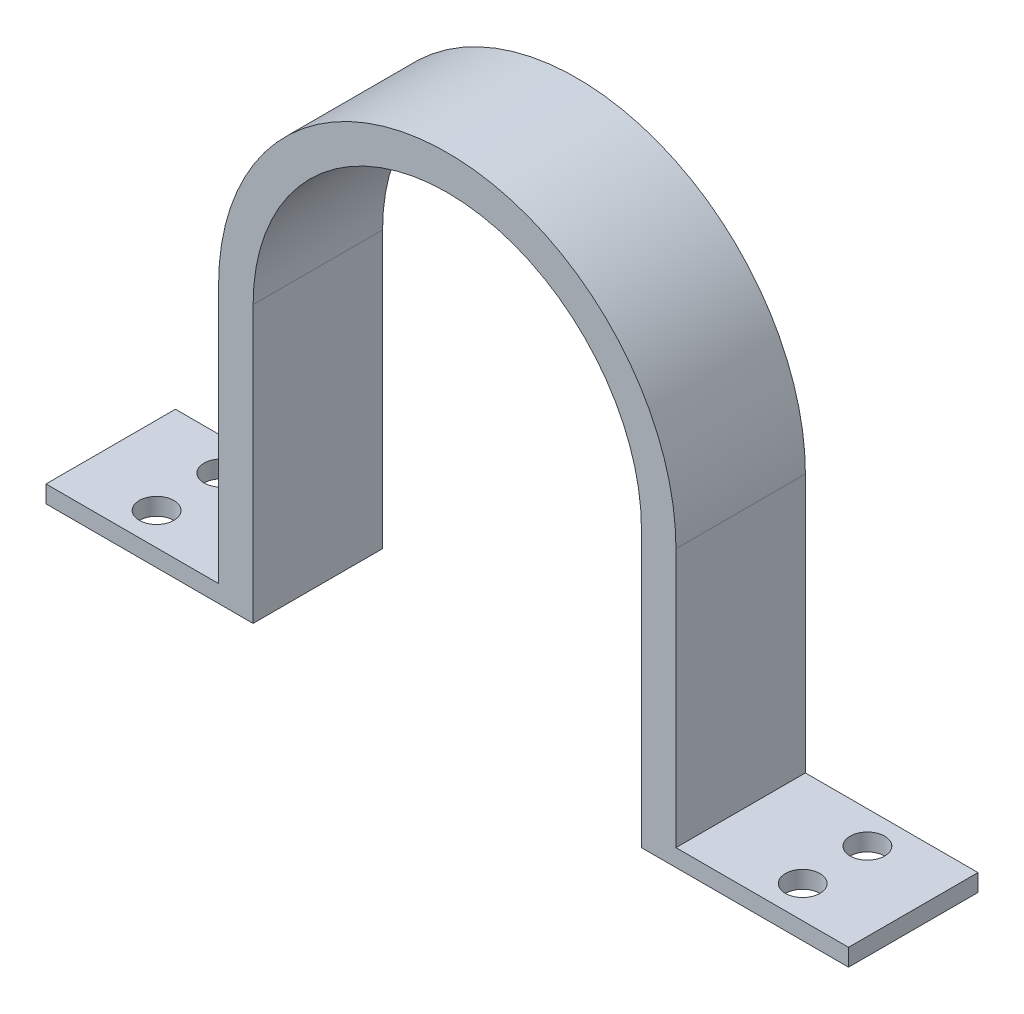
ISO-10303-21;
HEADER;
FILE_DESCRIPTION(('STEP AP214'),'2;1');
FILE_NAME('part.step','',(''),(''),'','','');
FILE_SCHEMA(('AUTOMOTIVE_DESIGN { 1 0 10303 214 1 1 1 1 }'));
ENDSEC;
DATA;
#1=APPLICATION_CONTEXT('core data for automotive mechanical design processes');
#2=APPLICATION_PROTOCOL_DEFINITION('international standard','automotive_design',2000,#1);
#3=PRODUCT_CONTEXT('',#1,'mechanical');
#4=PRODUCT('Part','Part','',(#3));
#5=PRODUCT_RELATED_PRODUCT_CATEGORY('part','',(#4));
#6=PRODUCT_DEFINITION_FORMATION('','',#4);
#7=PRODUCT_DEFINITION_CONTEXT('part definition',#1,'design');
#8=PRODUCT_DEFINITION('design','',#6,#7);
#9=PRODUCT_DEFINITION_SHAPE('','',#8);
#10=(LENGTH_UNIT() NAMED_UNIT(*) SI_UNIT(.MILLI.,.METRE.));
#11=(NAMED_UNIT(*) PLANE_ANGLE_UNIT() SI_UNIT($,.RADIAN.));
#12=(NAMED_UNIT(*) SI_UNIT($,.STERADIAN.) SOLID_ANGLE_UNIT());
#13=UNCERTAINTY_MEASURE_WITH_UNIT(LENGTH_MEASURE(1.E-05),#10,'distance_accuracy_value','');
#14=(GEOMETRIC_REPRESENTATION_CONTEXT(3) GLOBAL_UNCERTAINTY_ASSIGNED_CONTEXT((#13)) GLOBAL_UNIT_ASSIGNED_CONTEXT((#10,
#11,#12)) REPRESENTATION_CONTEXT('',''));
#15=CARTESIAN_POINT('',(0.,0.,0.));
#16=DIRECTION('',(0.,0.,1.));
#17=DIRECTION('',(1.,0.,0.));
#18=AXIS2_PLACEMENT_3D('',#15,#16,#17);
#19=CARTESIAN_POINT('',(-22.5,0.,15.));
#20=DIRECTION('',(1.,0.,0.));
#21=DIRECTION('',(0.,1.,0.));
#22=AXIS2_PLACEMENT_3D('',#19,#20,#21);
#23=PLANE('',#22);
#24=DIRECTION('',(0.,-1.,0.));
#25=VECTOR('',#24,1.);
#26=CARTESIAN_POINT('',(-22.5,0.,0.));
#27=LINE('',#26,#25);
#28=CARTESIAN_POINT('',(-22.5,30.,0.));
#29=VERTEX_POINT('',#28);
#30=CARTESIAN_POINT('',(-22.5,-2.,0.));
#31=VERTEX_POINT('',#30);
#32=EDGE_CURVE('E167',#29,#31,#27,.T.);
#33=ORIENTED_EDGE('',*,*,#32,.F.);
#34=DIRECTION('',(0.,0.,-1.));
#35=VECTOR('',#34,1.);
#36=CARTESIAN_POINT('',(-22.5,30.,15.));
#37=LINE('',#36,#35);
#38=CARTESIAN_POINT('',(-22.5,30.,15.));
#39=VERTEX_POINT('',#38);
#40=EDGE_CURVE('E11',#39,#29,#37,.T.);
#41=ORIENTED_EDGE('',*,*,#40,.F.);
#42=DIRECTION('',(0.,-1.,0.));
#43=VECTOR('',#42,1.);
#44=CARTESIAN_POINT('',(-22.5,0.,15.));
#45=LINE('',#44,#43);
#46=CARTESIAN_POINT('',(-22.5,-2.,15.));
#47=VERTEX_POINT('',#46);
#48=EDGE_CURVE('E204',#39,#47,#45,.T.);
#49=ORIENTED_EDGE('',*,*,#48,.T.);
#50=DIRECTION('',(0.,0.,-1.));
#51=VECTOR('',#50,1.);
#52=CARTESIAN_POINT('',(-22.5,-2.,15.));
#53=LINE('',#52,#51);
#54=EDGE_CURVE('E109',#47,#31,#53,.T.);
#55=ORIENTED_EDGE('',*,*,#54,.T.);
#56=EDGE_LOOP('',(#33,#41,#49,#55));
#57=FACE_BOUND('',#56,.T.);
#58=ADVANCED_FACE('F45',(#57),#23,.T.);
#59=CARTESIAN_POINT('',(0.,30.,15.));
#60=DIRECTION('',(0.,0.,-1.));
#61=DIRECTION('',(-1.,0.,0.));
#62=AXIS2_PLACEMENT_3D('',#59,#60,#61);
#63=CYLINDRICAL_SURFACE('',#62,22.5);
#64=CARTESIAN_POINT('',(0.,30.,0.));
#65=DIRECTION('',(0.,0.,1.));
#66=DIRECTION('',(1.,0.,0.));
#67=AXIS2_PLACEMENT_3D('',#64,#65,#66);
#68=CIRCLE('',#67,22.5);
#69=CARTESIAN_POINT('',(22.5,30.,0.));
#70=VERTEX_POINT('',#69);
#71=EDGE_CURVE('E170',#29,#70,#68,.F.);
#72=ORIENTED_EDGE('',*,*,#71,.T.);
#73=DIRECTION('',(0.,0.,-1.));
#74=VECTOR('',#73,1.);
#75=CARTESIAN_POINT('',(22.5,30.,15.));
#76=LINE('',#75,#74);
#77=CARTESIAN_POINT('',(22.5,30.,15.));
#78=VERTEX_POINT('',#77);
#79=EDGE_CURVE('E54',#78,#70,#76,.T.);
#80=ORIENTED_EDGE('',*,*,#79,.F.);
#81=CARTESIAN_POINT('',(0.,30.,15.));
#82=DIRECTION('',(0.,0.,1.));
#83=DIRECTION('',(1.,0.,0.));
#84=AXIS2_PLACEMENT_3D('',#81,#82,#83);
#85=CIRCLE('',#84,22.5);
#86=EDGE_CURVE('E251',#39,#78,#85,.F.);
#87=ORIENTED_EDGE('',*,*,#86,.F.);
#88=ORIENTED_EDGE('',*,*,#40,.T.);
#89=EDGE_LOOP('',(#72,#80,#87,#88));
#90=FACE_BOUND('',#89,.T.);
#91=ADVANCED_FACE('F313',(#90),#63,.F.);
#92=CARTESIAN_POINT('',(22.5,0.,15.));
#93=DIRECTION('',(1.,0.,0.));
#94=DIRECTION('',(0.,1.,0.));
#95=AXIS2_PLACEMENT_3D('',#92,#93,#94);
#96=PLANE('',#95);
#97=DIRECTION('',(0.,-1.,0.));
#98=VECTOR('',#97,1.);
#99=CARTESIAN_POINT('',(22.5,0.,0.));
#100=LINE('',#99,#98);
#101=CARTESIAN_POINT('',(22.5,-2.,0.));
#102=VERTEX_POINT('',#101);
#103=EDGE_CURVE('E174',#70,#102,#100,.T.);
#104=ORIENTED_EDGE('',*,*,#103,.T.);
#105=DIRECTION('',(0.,0.,-1.));
#106=VECTOR('',#105,1.);
#107=CARTESIAN_POINT('',(22.5,-2.,15.));
#108=LINE('',#107,#106);
#109=CARTESIAN_POINT('',(22.5,-2.,15.));
#110=VERTEX_POINT('',#109);
#111=EDGE_CURVE('E221',#110,#102,#108,.T.);
#112=ORIENTED_EDGE('',*,*,#111,.F.);
#113=DIRECTION('',(0.,-1.,0.));
#114=VECTOR('',#113,1.);
#115=CARTESIAN_POINT('',(22.5,0.,15.));
#116=LINE('',#115,#114);
#117=EDGE_CURVE('E230',#78,#110,#116,.T.);
#118=ORIENTED_EDGE('',*,*,#117,.F.);
#119=ORIENTED_EDGE('',*,*,#79,.T.);
#120=EDGE_LOOP('',(#104,#112,#118,#119));
#121=FACE_BOUND('',#120,.T.);
#122=ADVANCED_FACE('F228',(#121),#96,.F.);
#123=CARTESIAN_POINT('',(0.,-2.00000000000001,15.));
#124=DIRECTION('',(0.,-1.,0.));
#125=DIRECTION('',(1.,0.,0.));
#126=AXIS2_PLACEMENT_3D('',#123,#124,#125);
#127=PLANE('',#126);
#128=CARTESIAN_POINT('',(37.43503243398,-2.,3.75));
#129=DIRECTION('',(0.,1.,0.));
#130=DIRECTION('',(1.,0.,0.));
#131=AXIS2_PLACEMENT_3D('',#128,#129,#130);
#132=CIRCLE('',#131,2.);
#133=CARTESIAN_POINT('',(39.43503243398,-2.,3.75));
#134=VERTEX_POINT('',#133);
#135=EDGE_CURVE('E302',#134,#134,#132,.T.);
#136=ORIENTED_EDGE('',*,*,#135,.T.);
#137=EDGE_LOOP('',(#136));
#138=FACE_BOUND('',#137,.T.);
#139=CARTESIAN_POINT('',(37.43503243398,-2.,11.25));
#140=DIRECTION('',(0.,1.,0.));
#141=DIRECTION('',(1.,0.,0.));
#142=AXIS2_PLACEMENT_3D('',#139,#140,#141);
#143=CIRCLE('',#142,2.);
#144=CARTESIAN_POINT('',(39.43503243398,-2.,11.25));
#145=VERTEX_POINT('',#144);
#146=EDGE_CURVE('E268',#145,#145,#143,.T.);
#147=ORIENTED_EDGE('',*,*,#146,.T.);
#148=EDGE_LOOP('',(#147));
#149=FACE_BOUND('',#148,.T.);
#150=DIRECTION('',(-1.,0.,0.));
#151=VECTOR('',#150,1.);
#152=CARTESIAN_POINT('',(0.,-2.00000000000001,0.));
#153=LINE('',#152,#151);
#154=CARTESIAN_POINT('',(46.5,-2.,0.));
#155=VERTEX_POINT('',#154);
#156=EDGE_CURVE('E177',#155,#102,#153,.T.);
#157=ORIENTED_EDGE('',*,*,#156,.F.);
#158=DIRECTION('',(0.,0.,-1.));
#159=VECTOR('',#158,1.);
#160=CARTESIAN_POINT('',(46.5,-2.,15.));
#161=LINE('',#160,#159);
#162=CARTESIAN_POINT('',(46.5,-2.,15.));
#163=VERTEX_POINT('',#162);
#164=EDGE_CURVE('E219',#163,#155,#161,.T.);
#165=ORIENTED_EDGE('',*,*,#164,.F.);
#166=DIRECTION('',(-1.,0.,0.));
#167=VECTOR('',#166,1.);
#168=CARTESIAN_POINT('',(0.,-2.00000000000001,15.));
#169=LINE('',#168,#167);
#170=EDGE_CURVE('E241',#163,#110,#169,.T.);
#171=ORIENTED_EDGE('',*,*,#170,.T.);
#172=ORIENTED_EDGE('',*,*,#111,.T.);
#173=EDGE_LOOP('',(#157,#165,#171,#172));
#174=FACE_BOUND('',#173,.T.);
#175=ADVANCED_FACE('F238',(#138,#149,#174),#127,.T.);
#176=CARTESIAN_POINT('',(46.5,0.,15.));
#177=DIRECTION('',(1.,0.,0.));
#178=DIRECTION('',(0.,0.,-1.));
#179=AXIS2_PLACEMENT_3D('',#176,#177,#178);
#180=PLANE('',#179);
#181=DIRECTION('',(0.,-1.,0.));
#182=VECTOR('',#181,1.);
#183=CARTESIAN_POINT('',(46.5,0.,0.));
#184=LINE('',#183,#182);
#185=CARTESIAN_POINT('',(46.5,0.,0.));
#186=VERTEX_POINT('',#185);
#187=EDGE_CURVE('E181',#186,#155,#184,.T.);
#188=ORIENTED_EDGE('',*,*,#187,.F.);
#189=DIRECTION('',(0.,0.,-1.));
#190=VECTOR('',#189,1.);
#191=CARTESIAN_POINT('',(46.5,0.,15.));
#192=LINE('',#191,#190);
#193=CARTESIAN_POINT('',(46.5,0.,15.));
#194=VERTEX_POINT('',#193);
#195=EDGE_CURVE('E217',#194,#186,#192,.T.);
#196=ORIENTED_EDGE('',*,*,#195,.F.);
#197=DIRECTION('',(0.,-1.,0.));
#198=VECTOR('',#197,1.);
#199=CARTESIAN_POINT('',(46.5,0.,15.));
#200=LINE('',#199,#198);
#201=EDGE_CURVE('E245',#194,#163,#200,.T.);
#202=ORIENTED_EDGE('',*,*,#201,.T.);
#203=ORIENTED_EDGE('',*,*,#164,.T.);
#204=EDGE_LOOP('',(#188,#196,#202,#203));
#205=FACE_BOUND('',#204,.T.);
#206=ADVANCED_FACE('F323',(#205),#180,.T.);
#207=CARTESIAN_POINT('',(0.,0.,15.));
#208=DIRECTION('',(0.,1.,0.));
#209=DIRECTION('',(0.,0.,1.));
#210=AXIS2_PLACEMENT_3D('',#207,#208,#209);
#211=PLANE('',#210);
#212=CARTESIAN_POINT('',(37.43503243398,0.,3.75));
#213=DIRECTION('',(0.,1.,0.));
#214=DIRECTION('',(1.,0.,0.));
#215=AXIS2_PLACEMENT_3D('',#212,#213,#214);
#216=CIRCLE('',#215,2.);
#217=CARTESIAN_POINT('',(39.43503243398,0.,3.75));
#218=VERTEX_POINT('',#217);
#219=EDGE_CURVE('E273',#218,#218,#216,.T.);
#220=ORIENTED_EDGE('',*,*,#219,.F.);
#221=EDGE_LOOP('',(#220));
#222=FACE_BOUND('',#221,.T.);
#223=CARTESIAN_POINT('',(37.43503243398,0.,11.25));
#224=DIRECTION('',(0.,1.,0.));
#225=DIRECTION('',(1.,0.,0.));
#226=AXIS2_PLACEMENT_3D('',#223,#224,#225);
#227=CIRCLE('',#226,2.);
#228=CARTESIAN_POINT('',(39.43503243398,0.,11.25));
#229=VERTEX_POINT('',#228);
#230=EDGE_CURVE('E272',#229,#229,#227,.T.);
#231=ORIENTED_EDGE('',*,*,#230,.F.);
#232=EDGE_LOOP('',(#231));
#233=FACE_BOUND('',#232,.T.);
#234=DIRECTION('',(1.,0.,0.));
#235=VECTOR('',#234,1.);
#236=CARTESIAN_POINT('',(0.,0.,0.));
#237=LINE('',#236,#235);
#238=CARTESIAN_POINT('',(26.5,0.,0.));
#239=VERTEX_POINT('',#238);
#240=EDGE_CURVE('E184',#239,#186,#237,.T.);
#241=ORIENTED_EDGE('',*,*,#240,.F.);
#242=DIRECTION('',(0.,0.,-1.));
#243=VECTOR('',#242,1.);
#244=CARTESIAN_POINT('',(26.5,0.,15.));
#245=LINE('',#244,#243);
#246=CARTESIAN_POINT('',(26.5,0.,15.));
#247=VERTEX_POINT('',#246);
#248=EDGE_CURVE('E215',#247,#239,#245,.T.);
#249=ORIENTED_EDGE('',*,*,#248,.F.);
#250=DIRECTION('',(1.,0.,0.));
#251=VECTOR('',#250,1.);
#252=CARTESIAN_POINT('',(0.,0.,15.));
#253=LINE('',#252,#251);
#254=EDGE_CURVE('E248',#247,#194,#253,.T.);
#255=ORIENTED_EDGE('',*,*,#254,.T.);
#256=ORIENTED_EDGE('',*,*,#195,.T.);
#257=EDGE_LOOP('',(#241,#249,#255,#256));
#258=FACE_BOUND('',#257,.T.);
#259=ADVANCED_FACE('F327',(#222,#233,#258),#211,.T.);
#260=CARTESIAN_POINT('',(26.5,0.,15.));
#261=DIRECTION('',(-1.,0.,0.));
#262=DIRECTION('',(0.,-1.,0.));
#263=AXIS2_PLACEMENT_3D('',#260,#261,#262);
#264=PLANE('',#263);
#265=DIRECTION('',(0.,1.,0.));
#266=VECTOR('',#265,1.);
#267=CARTESIAN_POINT('',(26.5,0.,0.));
#268=LINE('',#267,#266);
#269=CARTESIAN_POINT('',(26.5,30.,0.));
#270=VERTEX_POINT('',#269);
#271=EDGE_CURVE('E187',#239,#270,#268,.T.);
#272=ORIENTED_EDGE('',*,*,#271,.T.);
#273=DIRECTION('',(0.,0.,-1.));
#274=VECTOR('',#273,1.);
#275=CARTESIAN_POINT('',(26.5,30.,15.));
#276=LINE('',#275,#274);
#277=CARTESIAN_POINT('',(26.5,30.,15.));
#278=VERTEX_POINT('',#277);
#279=EDGE_CURVE('E212',#278,#270,#276,.T.);
#280=ORIENTED_EDGE('',*,*,#279,.F.);
#281=DIRECTION('',(0.,1.,0.));
#282=VECTOR('',#281,1.);
#283=CARTESIAN_POINT('',(26.5,0.,15.));
#284=LINE('',#283,#282);
#285=EDGE_CURVE('E258',#247,#278,#284,.T.);
#286=ORIENTED_EDGE('',*,*,#285,.F.);
#287=ORIENTED_EDGE('',*,*,#248,.T.);
#288=EDGE_LOOP('',(#272,#280,#286,#287));
#289=FACE_BOUND('',#288,.T.);
#290=ADVANCED_FACE('F331',(#289),#264,.F.);
#291=CARTESIAN_POINT('',(0.,30.,15.));
#292=DIRECTION('',(0.,0.,-1.));
#293=DIRECTION('',(-1.,0.,0.));
#294=AXIS2_PLACEMENT_3D('',#291,#292,#293);
#295=CYLINDRICAL_SURFACE('',#294,26.5);
#296=CARTESIAN_POINT('',(0.,30.,0.));
#297=DIRECTION('',(0.,0.,1.));
#298=DIRECTION('',(1.,0.,0.));
#299=AXIS2_PLACEMENT_3D('',#296,#297,#298);
#300=CIRCLE('',#299,26.5);
#301=CARTESIAN_POINT('',(-26.5,30.,0.));
#302=VERTEX_POINT('',#301);
#303=EDGE_CURVE('E191',#302,#270,#300,.F.);
#304=ORIENTED_EDGE('',*,*,#303,.F.);
#305=DIRECTION('',(0.,0.,-1.));
#306=VECTOR('',#305,1.);
#307=CARTESIAN_POINT('',(-26.5,30.,15.));
#308=LINE('',#307,#306);
#309=CARTESIAN_POINT('',(-26.5,30.,15.));
#310=VERTEX_POINT('',#309);
#311=EDGE_CURVE('E209',#310,#302,#308,.T.);
#312=ORIENTED_EDGE('',*,*,#311,.F.);
#313=CARTESIAN_POINT('',(0.,30.,15.));
#314=DIRECTION('',(0.,0.,1.));
#315=DIRECTION('',(1.,0.,0.));
#316=AXIS2_PLACEMENT_3D('',#313,#314,#315);
#317=CIRCLE('',#316,26.5);
#318=EDGE_CURVE('E261',#310,#278,#317,.F.);
#319=ORIENTED_EDGE('',*,*,#318,.T.);
#320=ORIENTED_EDGE('',*,*,#279,.T.);
#321=EDGE_LOOP('',(#304,#312,#319,#320));
#322=FACE_BOUND('',#321,.T.);
#323=ADVANCED_FACE('F335',(#322),#295,.T.);
#324=CARTESIAN_POINT('',(-26.5,0.,15.));
#325=DIRECTION('',(1.,0.,0.));
#326=DIRECTION('',(0.,0.,-1.));
#327=AXIS2_PLACEMENT_3D('',#324,#325,#326);
#328=PLANE('',#327);
#329=DIRECTION('',(0.,-1.,0.));
#330=VECTOR('',#329,1.);
#331=CARTESIAN_POINT('',(-26.5,0.,0.));
#332=LINE('',#331,#330);
#333=CARTESIAN_POINT('',(-26.5,0.,0.));
#334=VERTEX_POINT('',#333);
#335=EDGE_CURVE('E195',#302,#334,#332,.T.);
#336=ORIENTED_EDGE('',*,*,#335,.T.);
#337=DIRECTION('',(0.,0.,-1.));
#338=VECTOR('',#337,1.);
#339=CARTESIAN_POINT('',(-26.5,0.,15.));
#340=LINE('',#339,#338);
#341=CARTESIAN_POINT('',(-26.5,0.,15.));
#342=VERTEX_POINT('',#341);
#343=EDGE_CURVE('E158',#342,#334,#340,.T.);
#344=ORIENTED_EDGE('',*,*,#343,.F.);
#345=DIRECTION('',(0.,-1.,0.));
#346=VECTOR('',#345,1.);
#347=CARTESIAN_POINT('',(-26.5,0.,15.));
#348=LINE('',#347,#346);
#349=EDGE_CURVE('E147',#310,#342,#348,.T.);
#350=ORIENTED_EDGE('',*,*,#349,.F.);
#351=ORIENTED_EDGE('',*,*,#311,.T.);
#352=EDGE_LOOP('',(#336,#344,#350,#351));
#353=FACE_BOUND('',#352,.T.);
#354=ADVANCED_FACE('F339',(#353),#328,.F.);
#355=CARTESIAN_POINT('',(0.,0.,15.));
#356=DIRECTION('',(0.,-1.,0.));
#357=DIRECTION('',(1.,0.,0.));
#358=AXIS2_PLACEMENT_3D('',#355,#356,#357);
#359=PLANE('',#358);
#360=CARTESIAN_POINT('',(-37.43503243398,0.,11.25));
#361=DIRECTION('',(0.,1.,0.));
#362=DIRECTION('',(-1.,0.,0.));
#363=AXIS2_PLACEMENT_3D('',#360,#361,#362);
#364=CIRCLE('',#363,2.);
#365=CARTESIAN_POINT('',(-39.43503243398,0.,11.25));
#366=VERTEX_POINT('',#365);
#367=EDGE_CURVE('E281',#366,#366,#364,.T.);
#368=ORIENTED_EDGE('',*,*,#367,.F.);
#369=EDGE_LOOP('',(#368));
#370=FACE_BOUND('',#369,.T.);
#371=CARTESIAN_POINT('',(-37.43503243398,0.,3.75));
#372=DIRECTION('',(0.,1.,0.));
#373=DIRECTION('',(-1.,0.,0.));
#374=AXIS2_PLACEMENT_3D('',#371,#372,#373);
#375=CIRCLE('',#374,2.);
#376=CARTESIAN_POINT('',(-39.43503243398,0.,3.75));
#377=VERTEX_POINT('',#376);
#378=EDGE_CURVE('E285',#377,#377,#375,.T.);
#379=ORIENTED_EDGE('',*,*,#378,.F.);
#380=EDGE_LOOP('',(#379));
#381=FACE_BOUND('',#380,.T.);
#382=DIRECTION('',(-1.,0.,0.));
#383=VECTOR('',#382,1.);
#384=CARTESIAN_POINT('',(0.,0.,0.));
#385=LINE('',#384,#383);
#386=CARTESIAN_POINT('',(-46.5,0.,0.));
#387=VERTEX_POINT('',#386);
#388=EDGE_CURVE('E156',#334,#387,#385,.T.);
#389=ORIENTED_EDGE('',*,*,#388,.T.);
#390=DIRECTION('',(0.,0.,-1.));
#391=VECTOR('',#390,1.);
#392=CARTESIAN_POINT('',(-46.5,0.,15.));
#393=LINE('',#392,#391);
#394=CARTESIAN_POINT('',(-46.5,0.,15.));
#395=VERTEX_POINT('',#394);
#396=EDGE_CURVE('E153',#395,#387,#393,.T.);
#397=ORIENTED_EDGE('',*,*,#396,.F.);
#398=DIRECTION('',(-1.,0.,0.));
#399=VECTOR('',#398,1.);
#400=CARTESIAN_POINT('',(0.,0.,15.));
#401=LINE('',#400,#399);
#402=EDGE_CURVE('E140',#342,#395,#401,.T.);
#403=ORIENTED_EDGE('',*,*,#402,.F.);
#404=ORIENTED_EDGE('',*,*,#343,.T.);
#405=EDGE_LOOP('',(#389,#397,#403,#404));
#406=FACE_BOUND('',#405,.T.);
#407=ADVANCED_FACE('F154',(#370,#381,#406),#359,.F.);
#408=CARTESIAN_POINT('',(-46.5,0.,15.));
#409=DIRECTION('',(1.,0.,0.));
#410=DIRECTION('',(0.,0.,-1.));
#411=AXIS2_PLACEMENT_3D('',#408,#409,#410);
#412=PLANE('',#411);
#413=DIRECTION('',(0.,-1.,0.));
#414=VECTOR('',#413,1.);
#415=CARTESIAN_POINT('',(-46.5,0.,0.));
#416=LINE('',#415,#414);
#417=CARTESIAN_POINT('',(-46.5,-2.,0.));
#418=VERTEX_POINT('',#417);
#419=EDGE_CURVE('E102',#387,#418,#416,.T.);
#420=ORIENTED_EDGE('',*,*,#419,.T.);
#421=DIRECTION('',(0.,0.,-1.));
#422=VECTOR('',#421,1.);
#423=CARTESIAN_POINT('',(-46.5,-2.,15.));
#424=LINE('',#423,#422);
#425=CARTESIAN_POINT('',(-46.5,-2.,15.));
#426=VERTEX_POINT('',#425);
#427=EDGE_CURVE('E159',#426,#418,#424,.T.);
#428=ORIENTED_EDGE('',*,*,#427,.F.);
#429=DIRECTION('',(0.,-1.,0.));
#430=VECTOR('',#429,1.);
#431=CARTESIAN_POINT('',(-46.5,0.,15.));
#432=LINE('',#431,#430);
#433=EDGE_CURVE('E144',#395,#426,#432,.T.);
#434=ORIENTED_EDGE('',*,*,#433,.F.);
#435=ORIENTED_EDGE('',*,*,#396,.T.);
#436=EDGE_LOOP('',(#420,#428,#434,#435));
#437=FACE_BOUND('',#436,.T.);
#438=ADVANCED_FACE('F161',(#437),#412,.F.);
#439=CARTESIAN_POINT('',(0.,-2.,15.));
#440=DIRECTION('',(0.,1.,0.));
#441=DIRECTION('',(0.,0.,1.));
#442=AXIS2_PLACEMENT_3D('',#439,#440,#441);
#443=PLANE('',#442);
#444=CARTESIAN_POINT('',(-37.43503243398,-2.00000000000001,11.25));
#445=DIRECTION('',(0.,1.,0.));
#446=DIRECTION('',(-1.,0.,0.));
#447=AXIS2_PLACEMENT_3D('',#444,#445,#446);
#448=CIRCLE('',#447,2.);
#449=CARTESIAN_POINT('',(-39.43503243398,-2.00000000000001,11.25));
#450=VERTEX_POINT('',#449);
#451=EDGE_CURVE('E286',#450,#450,#448,.T.);
#452=ORIENTED_EDGE('',*,*,#451,.T.);
#453=EDGE_LOOP('',(#452));
#454=FACE_BOUND('',#453,.T.);
#455=CARTESIAN_POINT('',(-37.43503243398,-2.00000000000001,3.75));
#456=DIRECTION('',(0.,1.,0.));
#457=DIRECTION('',(-1.,0.,0.));
#458=AXIS2_PLACEMENT_3D('',#455,#456,#457);
#459=CIRCLE('',#458,2.);
#460=CARTESIAN_POINT('',(-39.43503243398,-2.00000000000001,3.75));
#461=VERTEX_POINT('',#460);
#462=EDGE_CURVE('E171',#461,#461,#459,.T.);
#463=ORIENTED_EDGE('',*,*,#462,.T.);
#464=EDGE_LOOP('',(#463));
#465=FACE_BOUND('',#464,.T.);
#466=DIRECTION('',(1.,0.,0.));
#467=VECTOR('',#466,1.);
#468=CARTESIAN_POINT('',(0.,-2.,0.));
#469=LINE('',#468,#467);
#470=EDGE_CURVE('E201',#418,#31,#469,.T.);
#471=ORIENTED_EDGE('',*,*,#470,.T.);
#472=ORIENTED_EDGE('',*,*,#54,.F.);
#473=DIRECTION('',(1.,0.,0.));
#474=VECTOR('',#473,1.);
#475=CARTESIAN_POINT('',(0.,-2.,15.));
#476=LINE('',#475,#474);
#477=EDGE_CURVE('E62',#426,#47,#476,.T.);
#478=ORIENTED_EDGE('',*,*,#477,.F.);
#479=ORIENTED_EDGE('',*,*,#427,.T.);
#480=EDGE_LOOP('',(#471,#472,#478,#479));
#481=FACE_BOUND('',#480,.T.);
#482=ADVANCED_FACE('F349',(#454,#465,#481),#443,.F.);
#483=CARTESIAN_POINT('',(0.,0.,15.));
#484=DIRECTION('',(0.,0.,1.));
#485=DIRECTION('',(1.,0.,0.));
#486=AXIS2_PLACEMENT_3D('',#483,#484,#485);
#487=PLANE('',#486);
#488=ORIENTED_EDGE('',*,*,#48,.F.);
#489=ORIENTED_EDGE('',*,*,#86,.T.);
#490=ORIENTED_EDGE('',*,*,#117,.T.);
#491=ORIENTED_EDGE('',*,*,#170,.F.);
#492=ORIENTED_EDGE('',*,*,#201,.F.);
#493=ORIENTED_EDGE('',*,*,#254,.F.);
#494=ORIENTED_EDGE('',*,*,#285,.T.);
#495=ORIENTED_EDGE('',*,*,#318,.F.);
#496=ORIENTED_EDGE('',*,*,#349,.T.);
#497=ORIENTED_EDGE('',*,*,#402,.T.);
#498=ORIENTED_EDGE('',*,*,#433,.T.);
#499=ORIENTED_EDGE('',*,*,#477,.T.);
#500=EDGE_LOOP('',(#488,#489,#490,#491,#492,#493,#494,#495,#496,#497,#498,#499));
#501=FACE_BOUND('',#500,.T.);
#502=ADVANCED_FACE('F142',(#501),#487,.T.);
#503=CARTESIAN_POINT('',(0.,0.,0.));
#504=DIRECTION('',(0.,0.,1.));
#505=DIRECTION('',(1.,0.,0.));
#506=AXIS2_PLACEMENT_3D('',#503,#504,#505);
#507=PLANE('',#506);
#508=ORIENTED_EDGE('',*,*,#32,.T.);
#509=ORIENTED_EDGE('',*,*,#470,.F.);
#510=ORIENTED_EDGE('',*,*,#419,.F.);
#511=ORIENTED_EDGE('',*,*,#388,.F.);
#512=ORIENTED_EDGE('',*,*,#335,.F.);
#513=ORIENTED_EDGE('',*,*,#303,.T.);
#514=ORIENTED_EDGE('',*,*,#271,.F.);
#515=ORIENTED_EDGE('',*,*,#240,.T.);
#516=ORIENTED_EDGE('',*,*,#187,.T.);
#517=ORIENTED_EDGE('',*,*,#156,.T.);
#518=ORIENTED_EDGE('',*,*,#103,.F.);
#519=ORIENTED_EDGE('',*,*,#71,.F.);
#520=EDGE_LOOP('',(#508,#509,#510,#511,#512,#513,#514,#515,#516,#517,#518,#519));
#521=FACE_BOUND('',#520,.T.);
#522=ADVANCED_FACE('F234',(#521),#507,.F.);
#523=CARTESIAN_POINT('',(-37.43503243398,-2.00000000000001,3.75));
#524=DIRECTION('',(0.,1.,0.));
#525=DIRECTION('',(-1.,0.,0.));
#526=AXIS2_PLACEMENT_3D('',#523,#524,#525);
#527=CYLINDRICAL_SURFACE('',#526,2.);
#528=ORIENTED_EDGE('',*,*,#462,.F.);
#529=EDGE_LOOP('',(#528));
#530=FACE_BOUND('',#529,.T.);
#531=ORIENTED_EDGE('',*,*,#378,.T.);
#532=EDGE_LOOP('',(#531));
#533=FACE_BOUND('',#532,.T.);
#534=ADVANCED_FACE('F354',(#530,#533),#527,.F.);
#535=CARTESIAN_POINT('',(-37.43503243398,-2.00000000000001,11.25));
#536=DIRECTION('',(0.,1.,0.));
#537=DIRECTION('',(-1.,0.,0.));
#538=AXIS2_PLACEMENT_3D('',#535,#536,#537);
#539=CYLINDRICAL_SURFACE('',#538,2.);
#540=ORIENTED_EDGE('',*,*,#451,.F.);
#541=EDGE_LOOP('',(#540));
#542=FACE_BOUND('',#541,.T.);
#543=ORIENTED_EDGE('',*,*,#367,.T.);
#544=EDGE_LOOP('',(#543));
#545=FACE_BOUND('',#544,.T.);
#546=ADVANCED_FACE('F359',(#542,#545),#539,.F.);
#547=CARTESIAN_POINT('',(37.43503243398,-2.,11.25));
#548=DIRECTION('',(0.,1.,0.));
#549=DIRECTION('',(-1.,0.,0.));
#550=AXIS2_PLACEMENT_3D('',#547,#548,#549);
#551=CYLINDRICAL_SURFACE('',#550,2.);
#552=ORIENTED_EDGE('',*,*,#146,.F.);
#553=EDGE_LOOP('',(#552));
#554=FACE_BOUND('',#553,.T.);
#555=ORIENTED_EDGE('',*,*,#230,.T.);
#556=EDGE_LOOP('',(#555));
#557=FACE_BOUND('',#556,.T.);
#558=ADVANCED_FACE('F364',(#554,#557),#551,.F.);
#559=CARTESIAN_POINT('',(37.43503243398,-2.,3.75));
#560=DIRECTION('',(0.,1.,0.));
#561=DIRECTION('',(-1.,0.,0.));
#562=AXIS2_PLACEMENT_3D('',#559,#560,#561);
#563=CYLINDRICAL_SURFACE('',#562,2.);
#564=ORIENTED_EDGE('',*,*,#135,.F.);
#565=EDGE_LOOP('',(#564));
#566=FACE_BOUND('',#565,.T.);
#567=ORIENTED_EDGE('',*,*,#219,.T.);
#568=EDGE_LOOP('',(#567));
#569=FACE_BOUND('',#568,.T.);
#570=ADVANCED_FACE('F361',(#566,#569),#563,.F.);
#571=CLOSED_SHELL('',(#58,#91,#122,#175,#206,#259,#290,#323,#354,#407,#438,#482,#502,#522,#534,
#546,#558,#570));
#572=MANIFOLD_SOLID_BREP('B2',#571);
#573=ADVANCED_BREP_SHAPE_REPRESENTATION('',(#18,#572),#14);
#574=SHAPE_DEFINITION_REPRESENTATION(#9,#573);
ENDSEC;
END-ISO-10303-21;
